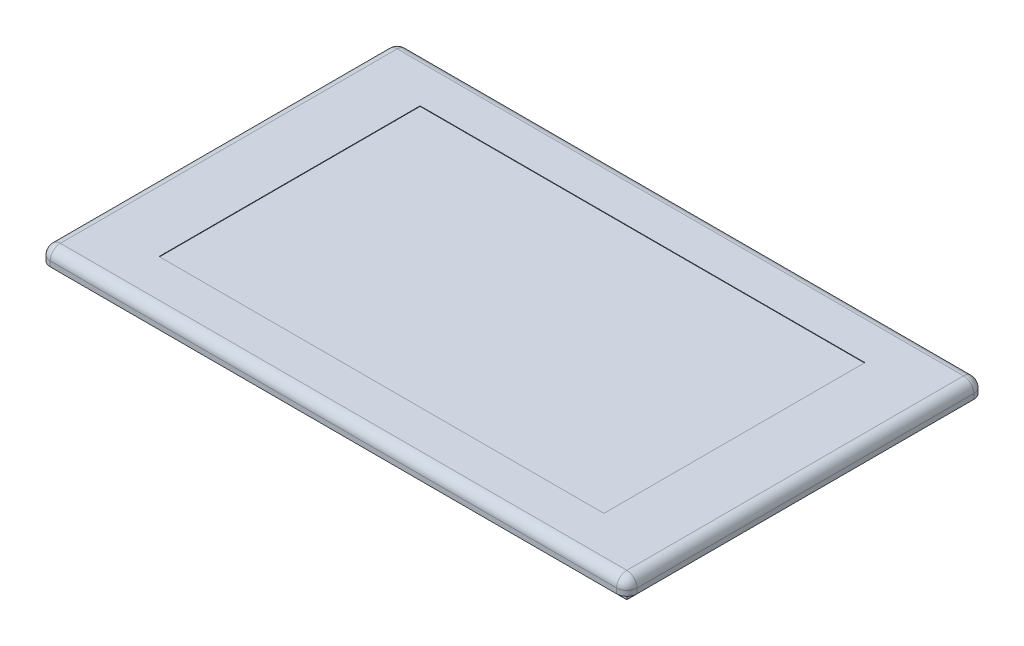
ISO-10303-21;
HEADER;
FILE_DESCRIPTION(('STEP AP214'),'2;1');
FILE_NAME('part.step','',(''),(''),'','','');
FILE_SCHEMA(('AUTOMOTIVE_DESIGN { 1 0 10303 214 1 1 1 1 }'));
ENDSEC;
DATA;
#1=APPLICATION_CONTEXT('core data for automotive mechanical design processes');
#2=APPLICATION_PROTOCOL_DEFINITION('international standard','automotive_design',2000,#1);
#3=PRODUCT_CONTEXT('',#1,'mechanical');
#4=PRODUCT('Part','Part','',(#3));
#5=PRODUCT_RELATED_PRODUCT_CATEGORY('part','',(#4));
#6=PRODUCT_DEFINITION_FORMATION('','',#4);
#7=PRODUCT_DEFINITION_CONTEXT('part definition',#1,'design');
#8=PRODUCT_DEFINITION('design','',#6,#7);
#9=PRODUCT_DEFINITION_SHAPE('','',#8);
#10=(LENGTH_UNIT() NAMED_UNIT(*) SI_UNIT(.MILLI.,.METRE.));
#11=(NAMED_UNIT(*) PLANE_ANGLE_UNIT() SI_UNIT($,.RADIAN.));
#12=(NAMED_UNIT(*) SI_UNIT($,.STERADIAN.) SOLID_ANGLE_UNIT());
#13=UNCERTAINTY_MEASURE_WITH_UNIT(LENGTH_MEASURE(1.E-05),#10,'distance_accuracy_value','');
#14=(GEOMETRIC_REPRESENTATION_CONTEXT(3) GLOBAL_UNCERTAINTY_ASSIGNED_CONTEXT((#13)) GLOBAL_UNIT_ASSIGNED_CONTEXT((#10,
#11,#12)) REPRESENTATION_CONTEXT('',''));
#15=CARTESIAN_POINT('',(0.,0.,0.));
#16=DIRECTION('',(0.,0.,1.));
#17=DIRECTION('',(1.,0.,0.));
#18=AXIS2_PLACEMENT_3D('',#15,#16,#17);
#19=CARTESIAN_POINT('',(0.,0.,0.));
#20=DIRECTION('',(0.,1.,0.));
#21=DIRECTION('',(0.,0.,1.));
#22=AXIS2_PLACEMENT_3D('',#19,#20,#21);
#23=PLANE('',#22);
#24=DIRECTION('',(1.,0.,0.));
#25=VECTOR('',#24,1.);
#26=CARTESIAN_POINT('',(-57.5,0.,35.));
#27=LINE('',#26,#25);
#28=CARTESIAN_POINT('',(-55.5,0.,35.));
#29=VERTEX_POINT('',#28);
#30=CARTESIAN_POINT('',(55.5,0.,35.));
#31=VERTEX_POINT('',#30);
#32=EDGE_CURVE('E257',#29,#31,#27,.T.);
#33=ORIENTED_EDGE('',*,*,#32,.F.);
#34=CARTESIAN_POINT('',(-55.5,0.,33.));
#35=DIRECTION('',(0.,1.,0.));
#36=DIRECTION('',(0.,0.,1.));
#37=AXIS2_PLACEMENT_3D('',#34,#35,#36);
#38=CIRCLE('',#37,2.);
#39=CARTESIAN_POINT('',(-57.5,0.,33.));
#40=VERTEX_POINT('',#39);
#41=EDGE_CURVE('E13',#29,#40,#38,.F.);
#42=ORIENTED_EDGE('',*,*,#41,.T.);
#43=DIRECTION('',(0.,0.,1.));
#44=VECTOR('',#43,1.);
#45=CARTESIAN_POINT('',(-57.5,0.,-35.));
#46=LINE('',#45,#44);
#47=CARTESIAN_POINT('',(-57.5,0.,-33.));
#48=VERTEX_POINT('',#47);
#49=EDGE_CURVE('E254',#48,#40,#46,.T.);
#50=ORIENTED_EDGE('',*,*,#49,.F.);
#51=CARTESIAN_POINT('',(-55.5,0.,-33.));
#52=DIRECTION('',(0.,1.,0.));
#53=DIRECTION('',(0.,0.,1.));
#54=AXIS2_PLACEMENT_3D('',#51,#52,#53);
#55=CIRCLE('',#54,2.);
#56=CARTESIAN_POINT('',(-55.5,0.,-35.));
#57=VERTEX_POINT('',#56);
#58=EDGE_CURVE('E59',#48,#57,#55,.F.);
#59=ORIENTED_EDGE('',*,*,#58,.T.);
#60=DIRECTION('',(-1.,0.,0.));
#61=VECTOR('',#60,1.);
#62=CARTESIAN_POINT('',(-57.5,0.,-35.));
#63=LINE('',#62,#61);
#64=CARTESIAN_POINT('',(55.5,0.,-35.));
#65=VERTEX_POINT('',#64);
#66=EDGE_CURVE('E251',#65,#57,#63,.T.);
#67=ORIENTED_EDGE('',*,*,#66,.F.);
#68=CARTESIAN_POINT('',(55.5,0.,-33.));
#69=DIRECTION('',(0.,1.,0.));
#70=DIRECTION('',(0.,0.,1.));
#71=AXIS2_PLACEMENT_3D('',#68,#69,#70);
#72=CIRCLE('',#71,2.);
#73=CARTESIAN_POINT('',(57.5,0.,-33.));
#74=VERTEX_POINT('',#73);
#75=EDGE_CURVE('E295',#65,#74,#72,.F.);
#76=ORIENTED_EDGE('',*,*,#75,.T.);
#77=DIRECTION('',(0.,0.,-1.));
#78=VECTOR('',#77,1.);
#79=CARTESIAN_POINT('',(57.5,0.,-35.));
#80=LINE('',#79,#78);
#81=CARTESIAN_POINT('',(57.5,0.,33.));
#82=VERTEX_POINT('',#81);
#83=EDGE_CURVE('E249',#82,#74,#80,.T.);
#84=ORIENTED_EDGE('',*,*,#83,.F.);
#85=CARTESIAN_POINT('',(55.5,0.,33.));
#86=DIRECTION('',(0.,1.,0.));
#87=DIRECTION('',(0.,0.,1.));
#88=AXIS2_PLACEMENT_3D('',#85,#86,#87);
#89=CIRCLE('',#88,2.);
#90=EDGE_CURVE('E293',#82,#31,#89,.F.);
#91=ORIENTED_EDGE('',*,*,#90,.T.);
#92=EDGE_LOOP('',(#33,#42,#50,#59,#67,#76,#84,#91));
#93=FACE_BOUND('',#92,.T.);
#94=DIRECTION('',(0.,0.,-1.));
#95=VECTOR('',#94,1.);
#96=CARTESIAN_POINT('',(-54.5,0.,32.));
#97=LINE('',#96,#95);
#98=CARTESIAN_POINT('',(-54.5,0.,32.));
#99=VERTEX_POINT('',#98);
#100=CARTESIAN_POINT('',(-54.5,0.,-32.));
#101=VERTEX_POINT('',#100);
#102=EDGE_CURVE('E227',#99,#101,#97,.T.);
#103=ORIENTED_EDGE('',*,*,#102,.F.);
#104=DIRECTION('',(-1.,0.,0.));
#105=VECTOR('',#104,1.);
#106=CARTESIAN_POINT('',(54.5,0.,32.));
#107=LINE('',#106,#105);
#108=CARTESIAN_POINT('',(54.5,0.,32.));
#109=VERTEX_POINT('',#108);
#110=EDGE_CURVE('E220',#109,#99,#107,.T.);
#111=ORIENTED_EDGE('',*,*,#110,.F.);
#112=DIRECTION('',(0.,0.,1.));
#113=VECTOR('',#112,1.);
#114=CARTESIAN_POINT('',(54.5,0.,32.));
#115=LINE('',#114,#113);
#116=CARTESIAN_POINT('',(54.5,0.,-32.));
#117=VERTEX_POINT('',#116);
#118=EDGE_CURVE('E233',#117,#109,#115,.T.);
#119=ORIENTED_EDGE('',*,*,#118,.F.);
#120=DIRECTION('',(1.,0.,0.));
#121=VECTOR('',#120,1.);
#122=CARTESIAN_POINT('',(54.5,0.,-32.));
#123=LINE('',#122,#121);
#124=EDGE_CURVE('E230',#101,#117,#123,.T.);
#125=ORIENTED_EDGE('',*,*,#124,.F.);
#126=EDGE_LOOP('',(#103,#111,#119,#125));
#127=FACE_BOUND('',#126,.T.);
#128=ADVANCED_FACE('F50',(#93,#127),#23,.F.);
#129=CARTESIAN_POINT('',(57.5,3.,-35.));
#130=DIRECTION('',(-1.,0.,0.));
#131=DIRECTION('',(0.,0.,1.));
#132=AXIS2_PLACEMENT_3D('',#129,#130,#131);
#133=PLANE('',#132);
#134=ORIENTED_EDGE('',*,*,#83,.T.);
#135=DIRECTION('',(0.,-1.,0.));
#136=VECTOR('',#135,1.);
#137=CARTESIAN_POINT('',(57.5,3.,-33.));
#138=LINE('',#137,#136);
#139=CARTESIAN_POINT('',(57.5,1.,-33.));
#140=VERTEX_POINT('',#139);
#141=EDGE_CURVE('E75',#74,#140,#138,.F.);
#142=ORIENTED_EDGE('',*,*,#141,.T.);
#143=DIRECTION('',(0.,0.,-1.));
#144=VECTOR('',#143,1.);
#145=CARTESIAN_POINT('',(57.5,1.,35.));
#146=LINE('',#145,#144);
#147=CARTESIAN_POINT('',(57.5,1.,33.));
#148=VERTEX_POINT('',#147);
#149=EDGE_CURVE('E290',#140,#148,#146,.F.);
#150=ORIENTED_EDGE('',*,*,#149,.T.);
#151=DIRECTION('',(0.,-1.,0.));
#152=VECTOR('',#151,1.);
#153=CARTESIAN_POINT('',(57.5,3.,33.));
#154=LINE('',#153,#152);
#155=EDGE_CURVE('E288',#148,#82,#154,.T.);
#156=ORIENTED_EDGE('',*,*,#155,.T.);
#157=EDGE_LOOP('',(#134,#142,#150,#156));
#158=FACE_BOUND('',#157,.T.);
#159=ADVANCED_FACE('F364',(#158),#133,.F.);
#160=CARTESIAN_POINT('',(-57.5,3.,-35.));
#161=DIRECTION('',(0.,0.,1.));
#162=DIRECTION('',(1.,0.,0.));
#163=AXIS2_PLACEMENT_3D('',#160,#161,#162);
#164=PLANE('',#163);
#165=ORIENTED_EDGE('',*,*,#66,.T.);
#166=DIRECTION('',(0.,-1.,0.));
#167=VECTOR('',#166,1.);
#168=CARTESIAN_POINT('',(-55.5,3.,-35.));
#169=LINE('',#168,#167);
#170=CARTESIAN_POINT('',(-55.5,1.,-35.));
#171=VERTEX_POINT('',#170);
#172=EDGE_CURVE('E286',#57,#171,#169,.F.);
#173=ORIENTED_EDGE('',*,*,#172,.T.);
#174=DIRECTION('',(-1.,0.,0.));
#175=VECTOR('',#174,1.);
#176=CARTESIAN_POINT('',(57.5,1.,-35.));
#177=LINE('',#176,#175);
#178=CARTESIAN_POINT('',(55.5,1.,-35.));
#179=VERTEX_POINT('',#178);
#180=EDGE_CURVE('E284',#171,#179,#177,.F.);
#181=ORIENTED_EDGE('',*,*,#180,.T.);
#182=DIRECTION('',(0.,-1.,0.));
#183=VECTOR('',#182,1.);
#184=CARTESIAN_POINT('',(55.5,3.,-35.));
#185=LINE('',#184,#183);
#186=EDGE_CURVE('E282',#179,#65,#185,.T.);
#187=ORIENTED_EDGE('',*,*,#186,.T.);
#188=EDGE_LOOP('',(#165,#173,#181,#187));
#189=FACE_BOUND('',#188,.T.);
#190=ADVANCED_FACE('F353',(#189),#164,.F.);
#191=CARTESIAN_POINT('',(-57.5,3.,-35.));
#192=DIRECTION('',(1.,0.,0.));
#193=DIRECTION('',(0.,0.,-1.));
#194=AXIS2_PLACEMENT_3D('',#191,#192,#193);
#195=PLANE('',#194);
#196=ORIENTED_EDGE('',*,*,#49,.T.);
#197=DIRECTION('',(0.,-1.,0.));
#198=VECTOR('',#197,1.);
#199=CARTESIAN_POINT('',(-57.5,3.,33.));
#200=LINE('',#199,#198);
#201=CARTESIAN_POINT('',(-57.5,1.,33.));
#202=VERTEX_POINT('',#201);
#203=EDGE_CURVE('E280',#40,#202,#200,.F.);
#204=ORIENTED_EDGE('',*,*,#203,.T.);
#205=DIRECTION('',(0.,0.,1.));
#206=VECTOR('',#205,1.);
#207=CARTESIAN_POINT('',(-57.5,1.,-35.));
#208=LINE('',#207,#206);
#209=CARTESIAN_POINT('',(-57.5,1.,-33.));
#210=VERTEX_POINT('',#209);
#211=EDGE_CURVE('E278',#202,#210,#208,.F.);
#212=ORIENTED_EDGE('',*,*,#211,.T.);
#213=DIRECTION('',(0.,-1.,0.));
#214=VECTOR('',#213,1.);
#215=CARTESIAN_POINT('',(-57.5,3.,-33.));
#216=LINE('',#215,#214);
#217=EDGE_CURVE('E276',#210,#48,#216,.T.);
#218=ORIENTED_EDGE('',*,*,#217,.T.);
#219=EDGE_LOOP('',(#196,#204,#212,#218));
#220=FACE_BOUND('',#219,.T.);
#221=ADVANCED_FACE('F389',(#220),#195,.F.);
#222=CARTESIAN_POINT('',(-57.5,3.,35.));
#223=DIRECTION('',(0.,0.,-1.));
#224=DIRECTION('',(-1.,0.,0.));
#225=AXIS2_PLACEMENT_3D('',#222,#223,#224);
#226=PLANE('',#225);
#227=DIRECTION('',(1.,0.,0.));
#228=VECTOR('',#227,1.);
#229=CARTESIAN_POINT('',(-57.5,1.,35.));
#230=LINE('',#229,#228);
#231=CARTESIAN_POINT('',(55.5,1.,35.));
#232=VERTEX_POINT('',#231);
#233=CARTESIAN_POINT('',(-55.5,1.,35.));
#234=VERTEX_POINT('',#233);
#235=EDGE_CURVE('E271',#232,#234,#230,.F.);
#236=ORIENTED_EDGE('',*,*,#235,.T.);
#237=DIRECTION('',(0.,-1.,0.));
#238=VECTOR('',#237,1.);
#239=CARTESIAN_POINT('',(-55.5,3.,35.));
#240=LINE('',#239,#238);
#241=EDGE_CURVE('E274',#234,#29,#240,.T.);
#242=ORIENTED_EDGE('',*,*,#241,.T.);
#243=ORIENTED_EDGE('',*,*,#32,.T.);
#244=DIRECTION('',(0.,-1.,0.));
#245=VECTOR('',#244,1.);
#246=CARTESIAN_POINT('',(55.5,3.,35.));
#247=LINE('',#246,#245);
#248=EDGE_CURVE('E269',#31,#232,#247,.F.);
#249=ORIENTED_EDGE('',*,*,#248,.T.);
#250=EDGE_LOOP('',(#236,#242,#243,#249));
#251=FACE_BOUND('',#250,.T.);
#252=ADVANCED_FACE('F381',(#251),#226,.F.);
#253=CARTESIAN_POINT('',(0.,3.,0.));
#254=DIRECTION('',(0.,1.,0.));
#255=DIRECTION('',(0.,0.,1.));
#256=AXIS2_PLACEMENT_3D('',#253,#254,#255);
#257=PLANE('',#256);
#258=DIRECTION('',(0.,0.,-1.));
#259=VECTOR('',#258,1.);
#260=CARTESIAN_POINT('',(43.5862200516437,3.,25.5777872693918));
#261=LINE('',#260,#259);
#262=CARTESIAN_POINT('',(43.5862200516437,3.,25.5777872693918));
#263=VERTEX_POINT('',#262);
#264=CARTESIAN_POINT('',(43.5862200516437,3.,-25.5777872693918));
#265=VERTEX_POINT('',#264);
#266=EDGE_CURVE('E67',#263,#265,#261,.T.);
#267=ORIENTED_EDGE('',*,*,#266,.F.);
#268=DIRECTION('',(1.,0.,0.));
#269=VECTOR('',#268,1.);
#270=CARTESIAN_POINT('',(-43.5862200516437,3.,25.5777872693918));
#271=LINE('',#270,#269);
#272=CARTESIAN_POINT('',(-43.5862200516437,3.,25.5777872693918));
#273=VERTEX_POINT('',#272);
#274=EDGE_CURVE('E197',#273,#263,#271,.T.);
#275=ORIENTED_EDGE('',*,*,#274,.F.);
#276=DIRECTION('',(0.,0.,1.));
#277=VECTOR('',#276,1.);
#278=CARTESIAN_POINT('',(-43.5862200516437,3.,25.5777872693918));
#279=LINE('',#278,#277);
#280=CARTESIAN_POINT('',(-43.5862200516437,3.,-25.5777872693918));
#281=VERTEX_POINT('',#280);
#282=EDGE_CURVE('E200',#281,#273,#279,.T.);
#283=ORIENTED_EDGE('',*,*,#282,.F.);
#284=DIRECTION('',(-1.,0.,0.));
#285=VECTOR('',#284,1.);
#286=CARTESIAN_POINT('',(-43.5862200516437,3.,-25.5777872693918));
#287=LINE('',#286,#285);
#288=EDGE_CURVE('E206',#265,#281,#287,.T.);
#289=ORIENTED_EDGE('',*,*,#288,.F.);
#290=EDGE_LOOP('',(#267,#275,#283,#289));
#291=FACE_BOUND('',#290,.T.);
#292=DIRECTION('',(0.,0.,1.));
#293=VECTOR('',#292,1.);
#294=CARTESIAN_POINT('',(-55.5,3.,35.));
#295=LINE('',#294,#293);
#296=CARTESIAN_POINT('',(-55.5,3.,-33.));
#297=VERTEX_POINT('',#296);
#298=CARTESIAN_POINT('',(-55.5,3.,33.));
#299=VERTEX_POINT('',#298);
#300=EDGE_CURVE('E264',#297,#299,#295,.T.);
#301=ORIENTED_EDGE('',*,*,#300,.T.);
#302=DIRECTION('',(1.,0.,0.));
#303=VECTOR('',#302,1.);
#304=CARTESIAN_POINT('',(57.5,3.,33.));
#305=LINE('',#304,#303);
#306=CARTESIAN_POINT('',(55.5,3.,33.));
#307=VERTEX_POINT('',#306);
#308=EDGE_CURVE('E266',#299,#307,#305,.T.);
#309=ORIENTED_EDGE('',*,*,#308,.T.);
#310=DIRECTION('',(0.,0.,-1.));
#311=VECTOR('',#310,1.);
#312=CARTESIAN_POINT('',(55.5,3.,-35.));
#313=LINE('',#312,#311);
#314=CARTESIAN_POINT('',(55.5,3.,-33.));
#315=VERTEX_POINT('',#314);
#316=EDGE_CURVE('E260',#307,#315,#313,.T.);
#317=ORIENTED_EDGE('',*,*,#316,.T.);
#318=DIRECTION('',(-1.,0.,0.));
#319=VECTOR('',#318,1.);
#320=CARTESIAN_POINT('',(-57.5,3.,-33.));
#321=LINE('',#320,#319);
#322=EDGE_CURVE('E262',#315,#297,#321,.T.);
#323=ORIENTED_EDGE('',*,*,#322,.T.);
#324=EDGE_LOOP('',(#301,#309,#317,#323));
#325=FACE_BOUND('',#324,.T.);
#326=ADVANCED_FACE('F343',(#291,#325),#257,.T.);
#327=CARTESIAN_POINT('',(-54.5,-3.,32.));
#328=DIRECTION('',(1.,0.,0.));
#329=DIRECTION('',(0.,0.,-1.));
#330=AXIS2_PLACEMENT_3D('',#327,#328,#329);
#331=PLANE('',#330);
#332=ORIENTED_EDGE('',*,*,#102,.T.);
#333=DIRECTION('',(0.,1.,0.));
#334=VECTOR('',#333,1.);
#335=CARTESIAN_POINT('',(-54.5,-3.,-32.));
#336=LINE('',#335,#334);
#337=CARTESIAN_POINT('',(-54.5,-3.,-32.));
#338=VERTEX_POINT('',#337);
#339=EDGE_CURVE('E246',#338,#101,#336,.T.);
#340=ORIENTED_EDGE('',*,*,#339,.F.);
#341=DIRECTION('',(0.,0.,-1.));
#342=VECTOR('',#341,1.);
#343=CARTESIAN_POINT('',(-54.5,-3.,32.));
#344=LINE('',#343,#342);
#345=CARTESIAN_POINT('',(-54.5,-3.,32.));
#346=VERTEX_POINT('',#345);
#347=EDGE_CURVE('E216',#346,#338,#344,.T.);
#348=ORIENTED_EDGE('',*,*,#347,.F.);
#349=DIRECTION('',(0.,1.,0.));
#350=VECTOR('',#349,1.);
#351=CARTESIAN_POINT('',(-54.5,-3.,32.));
#352=LINE('',#351,#350);
#353=EDGE_CURVE('E226',#346,#99,#352,.T.);
#354=ORIENTED_EDGE('',*,*,#353,.T.);
#355=EDGE_LOOP('',(#332,#340,#348,#354));
#356=FACE_BOUND('',#355,.T.);
#357=ADVANCED_FACE('F521',(#356),#331,.F.);
#358=CARTESIAN_POINT('',(54.5,-3.,-32.));
#359=DIRECTION('',(0.,0.,1.));
#360=DIRECTION('',(1.,0.,0.));
#361=AXIS2_PLACEMENT_3D('',#358,#359,#360);
#362=PLANE('',#361);
#363=ORIENTED_EDGE('',*,*,#124,.T.);
#364=DIRECTION('',(0.,1.,0.));
#365=VECTOR('',#364,1.);
#366=CARTESIAN_POINT('',(54.5,-3.,-32.));
#367=LINE('',#366,#365);
#368=CARTESIAN_POINT('',(54.5,-3.,-32.));
#369=VERTEX_POINT('',#368);
#370=EDGE_CURVE('E243',#369,#117,#367,.T.);
#371=ORIENTED_EDGE('',*,*,#370,.F.);
#372=DIRECTION('',(1.,0.,0.));
#373=VECTOR('',#372,1.);
#374=CARTESIAN_POINT('',(54.5,-3.,-32.));
#375=LINE('',#374,#373);
#376=EDGE_CURVE('E219',#338,#369,#375,.T.);
#377=ORIENTED_EDGE('',*,*,#376,.F.);
#378=ORIENTED_EDGE('',*,*,#339,.T.);
#379=EDGE_LOOP('',(#363,#371,#377,#378));
#380=FACE_BOUND('',#379,.T.);
#381=ADVANCED_FACE('F549',(#380),#362,.F.);
#382=CARTESIAN_POINT('',(54.5,-3.,32.));
#383=DIRECTION('',(-1.,0.,0.));
#384=DIRECTION('',(0.,0.,1.));
#385=AXIS2_PLACEMENT_3D('',#382,#383,#384);
#386=PLANE('',#385);
#387=ORIENTED_EDGE('',*,*,#118,.T.);
#388=DIRECTION('',(0.,1.,0.));
#389=VECTOR('',#388,1.);
#390=CARTESIAN_POINT('',(54.5,-3.,32.));
#391=LINE('',#390,#389);
#392=CARTESIAN_POINT('',(54.5,-3.,32.));
#393=VERTEX_POINT('',#392);
#394=EDGE_CURVE('E240',#393,#109,#391,.T.);
#395=ORIENTED_EDGE('',*,*,#394,.F.);
#396=DIRECTION('',(0.,0.,1.));
#397=VECTOR('',#396,1.);
#398=CARTESIAN_POINT('',(54.5,-3.,32.));
#399=LINE('',#398,#397);
#400=EDGE_CURVE('E222',#369,#393,#399,.T.);
#401=ORIENTED_EDGE('',*,*,#400,.F.);
#402=ORIENTED_EDGE('',*,*,#370,.T.);
#403=EDGE_LOOP('',(#387,#395,#401,#402));
#404=FACE_BOUND('',#403,.T.);
#405=ADVANCED_FACE('F556',(#404),#386,.F.);
#406=CARTESIAN_POINT('',(54.5,-3.,32.));
#407=DIRECTION('',(0.,0.,-1.));
#408=DIRECTION('',(-1.,0.,0.));
#409=AXIS2_PLACEMENT_3D('',#406,#407,#408);
#410=PLANE('',#409);
#411=ORIENTED_EDGE('',*,*,#110,.T.);
#412=ORIENTED_EDGE('',*,*,#353,.F.);
#413=DIRECTION('',(-1.,0.,0.));
#414=VECTOR('',#413,1.);
#415=CARTESIAN_POINT('',(54.5,-3.,32.));
#416=LINE('',#415,#414);
#417=EDGE_CURVE('E224',#393,#346,#416,.T.);
#418=ORIENTED_EDGE('',*,*,#417,.F.);
#419=ORIENTED_EDGE('',*,*,#394,.T.);
#420=EDGE_LOOP('',(#411,#412,#418,#419));
#421=FACE_BOUND('',#420,.T.);
#422=ADVANCED_FACE('F397',(#421),#410,.F.);
#423=CARTESIAN_POINT('',(0.,-3.,0.));
#424=DIRECTION('',(0.,1.,0.));
#425=DIRECTION('',(0.,0.,1.));
#426=AXIS2_PLACEMENT_3D('',#423,#424,#425);
#427=PLANE('',#426);
#428=ORIENTED_EDGE('',*,*,#347,.T.);
#429=ORIENTED_EDGE('',*,*,#376,.T.);
#430=ORIENTED_EDGE('',*,*,#400,.T.);
#431=ORIENTED_EDGE('',*,*,#417,.T.);
#432=EDGE_LOOP('',(#428,#429,#430,#431));
#433=FACE_BOUND('',#432,.T.);
#434=ADVANCED_FACE('F392',(#433),#427,.F.);
#435=CARTESIAN_POINT('',(-55.5,3.,-33.));
#436=DIRECTION('',(0.,-1.,0.));
#437=DIRECTION('',(0.,0.,-1.));
#438=AXIS2_PLACEMENT_3D('',#435,#436,#437);
#439=CYLINDRICAL_SURFACE('',#438,2.);
#440=ORIENTED_EDGE('',*,*,#58,.F.);
#441=ORIENTED_EDGE('',*,*,#217,.F.);
#442=CARTESIAN_POINT('',(-55.5,1.,-33.));
#443=DIRECTION('',(0.,1.,0.));
#444=DIRECTION('',(0.,0.,1.));
#445=AXIS2_PLACEMENT_3D('',#442,#443,#444);
#446=CIRCLE('',#445,2.);
#447=EDGE_CURVE('E54',#171,#210,#446,.T.);
#448=ORIENTED_EDGE('',*,*,#447,.F.);
#449=ORIENTED_EDGE('',*,*,#172,.F.);
#450=EDGE_LOOP('',(#440,#441,#448,#449));
#451=FACE_BOUND('',#450,.T.);
#452=ADVANCED_FACE('F52',(#451),#439,.T.);
#453=CARTESIAN_POINT('',(0.,1.,-33.));
#454=DIRECTION('',(1.,0.,0.));
#455=DIRECTION('',(0.,0.,-1.));
#456=AXIS2_PLACEMENT_3D('',#453,#454,#455);
#457=CYLINDRICAL_SURFACE('',#456,2.);
#458=CARTESIAN_POINT('',(55.5,1.,-33.));
#459=DIRECTION('',(1.,0.,0.));
#460=DIRECTION('',(0.,1.,0.));
#461=AXIS2_PLACEMENT_3D('',#458,#459,#460);
#462=CIRCLE('',#461,2.);
#463=EDGE_CURVE('E322',#179,#315,#462,.T.);
#464=ORIENTED_EDGE('',*,*,#463,.F.);
#465=ORIENTED_EDGE('',*,*,#180,.F.);
#466=CARTESIAN_POINT('',(-55.5,1.,-33.));
#467=DIRECTION('',(-1.,0.,0.));
#468=DIRECTION('',(0.,0.,1.));
#469=AXIS2_PLACEMENT_3D('',#466,#467,#468);
#470=CIRCLE('',#469,2.);
#471=EDGE_CURVE('E324',#297,#171,#470,.T.);
#472=ORIENTED_EDGE('',*,*,#471,.F.);
#473=ORIENTED_EDGE('',*,*,#322,.F.);
#474=EDGE_LOOP('',(#464,#465,#472,#473));
#475=FACE_BOUND('',#474,.T.);
#476=ADVANCED_FACE('F350',(#475),#457,.T.);
#477=CARTESIAN_POINT('',(55.5,3.,-33.));
#478=DIRECTION('',(0.,-1.,0.));
#479=DIRECTION('',(0.,0.,-1.));
#480=AXIS2_PLACEMENT_3D('',#477,#478,#479);
#481=CYLINDRICAL_SURFACE('',#480,2.);
#482=ORIENTED_EDGE('',*,*,#75,.F.);
#483=ORIENTED_EDGE('',*,*,#186,.F.);
#484=CARTESIAN_POINT('',(55.5,1.,-33.));
#485=DIRECTION('',(0.,1.,0.));
#486=DIRECTION('',(0.,0.,1.));
#487=AXIS2_PLACEMENT_3D('',#484,#485,#486);
#488=CIRCLE('',#487,2.);
#489=EDGE_CURVE('E319',#140,#179,#488,.T.);
#490=ORIENTED_EDGE('',*,*,#489,.F.);
#491=ORIENTED_EDGE('',*,*,#141,.F.);
#492=EDGE_LOOP('',(#482,#483,#490,#491));
#493=FACE_BOUND('',#492,.T.);
#494=ADVANCED_FACE('F357',(#493),#481,.T.);
#495=CARTESIAN_POINT('',(-55.5,1.,-33.));
#496=DIRECTION('',(0.,0.,1.));
#497=DIRECTION('',(1.,0.,0.));
#498=AXIS2_PLACEMENT_3D('',#495,#496,#497);
#499=SPHERICAL_SURFACE('',#498,2.);
#500=ORIENTED_EDGE('',*,*,#471,.T.);
#501=ORIENTED_EDGE('',*,*,#447,.T.);
#502=CARTESIAN_POINT('',(-55.5,1.,-33.));
#503=DIRECTION('',(0.,0.,-1.));
#504=DIRECTION('',(-1.,0.,0.));
#505=AXIS2_PLACEMENT_3D('',#502,#503,#504);
#506=CIRCLE('',#505,2.);
#507=EDGE_CURVE('E316',#297,#210,#506,.F.);
#508=ORIENTED_EDGE('',*,*,#507,.F.);
#509=EDGE_LOOP('',(#500,#501,#508));
#510=FACE_BOUND('',#509,.T.);
#511=ADVANCED_FACE('F331',(#510),#499,.T.);
#512=CARTESIAN_POINT('',(55.5,1.,-33.));
#513=DIRECTION('',(0.,0.,1.));
#514=DIRECTION('',(1.,0.,0.));
#515=AXIS2_PLACEMENT_3D('',#512,#513,#514);
#516=SPHERICAL_SURFACE('',#515,2.);
#517=ORIENTED_EDGE('',*,*,#489,.T.);
#518=ORIENTED_EDGE('',*,*,#463,.T.);
#519=CARTESIAN_POINT('',(55.5,1.,-33.));
#520=DIRECTION('',(0.,0.,-1.));
#521=DIRECTION('',(-1.,0.,0.));
#522=AXIS2_PLACEMENT_3D('',#519,#520,#521);
#523=CIRCLE('',#522,2.);
#524=EDGE_CURVE('E313',#140,#315,#523,.F.);
#525=ORIENTED_EDGE('',*,*,#524,.F.);
#526=EDGE_LOOP('',(#517,#518,#525));
#527=FACE_BOUND('',#526,.T.);
#528=ADVANCED_FACE('F431',(#527),#516,.T.);
#529=CARTESIAN_POINT('',(-55.5,3.,33.));
#530=DIRECTION('',(0.,-1.,0.));
#531=DIRECTION('',(0.,0.,-1.));
#532=AXIS2_PLACEMENT_3D('',#529,#530,#531);
#533=CYLINDRICAL_SURFACE('',#532,2.);
#534=ORIENTED_EDGE('',*,*,#41,.F.);
#535=ORIENTED_EDGE('',*,*,#241,.F.);
#536=CARTESIAN_POINT('',(-55.5,1.,33.));
#537=DIRECTION('',(0.,1.,0.));
#538=DIRECTION('',(0.,0.,1.));
#539=AXIS2_PLACEMENT_3D('',#536,#537,#538);
#540=CIRCLE('',#539,2.);
#541=EDGE_CURVE('E310',#202,#234,#540,.T.);
#542=ORIENTED_EDGE('',*,*,#541,.F.);
#543=ORIENTED_EDGE('',*,*,#203,.F.);
#544=EDGE_LOOP('',(#534,#535,#542,#543));
#545=FACE_BOUND('',#544,.T.);
#546=ADVANCED_FACE('F387',(#545),#533,.T.);
#547=CARTESIAN_POINT('',(-55.5,1.,0.));
#548=DIRECTION('',(0.,0.,-1.));
#549=DIRECTION('',(-1.,0.,0.));
#550=AXIS2_PLACEMENT_3D('',#547,#548,#549);
#551=CYLINDRICAL_SURFACE('',#550,2.);
#552=ORIENTED_EDGE('',*,*,#507,.T.);
#553=ORIENTED_EDGE('',*,*,#211,.F.);
#554=CARTESIAN_POINT('',(-55.5,1.,33.));
#555=DIRECTION('',(0.,0.,1.));
#556=DIRECTION('',(1.,0.,0.));
#557=AXIS2_PLACEMENT_3D('',#554,#555,#556);
#558=CIRCLE('',#557,2.);
#559=EDGE_CURVE('E307',#299,#202,#558,.T.);
#560=ORIENTED_EDGE('',*,*,#559,.F.);
#561=ORIENTED_EDGE('',*,*,#300,.F.);
#562=EDGE_LOOP('',(#552,#553,#560,#561));
#563=FACE_BOUND('',#562,.T.);
#564=ADVANCED_FACE('F338',(#563),#551,.T.);
#565=CARTESIAN_POINT('',(55.5,1.,0.));
#566=DIRECTION('',(0.,0.,1.));
#567=DIRECTION('',(1.,0.,0.));
#568=AXIS2_PLACEMENT_3D('',#565,#566,#567);
#569=CYLINDRICAL_SURFACE('',#568,2.);
#570=ORIENTED_EDGE('',*,*,#524,.T.);
#571=ORIENTED_EDGE('',*,*,#316,.F.);
#572=CARTESIAN_POINT('',(55.5,1.,33.));
#573=DIRECTION('',(0.,0.,1.));
#574=DIRECTION('',(1.,0.,0.));
#575=AXIS2_PLACEMENT_3D('',#572,#573,#574);
#576=CIRCLE('',#575,2.);
#577=EDGE_CURVE('E304',#148,#307,#576,.T.);
#578=ORIENTED_EDGE('',*,*,#577,.F.);
#579=ORIENTED_EDGE('',*,*,#149,.F.);
#580=EDGE_LOOP('',(#570,#571,#578,#579));
#581=FACE_BOUND('',#580,.T.);
#582=ADVANCED_FACE('F374',(#581),#569,.T.);
#583=CARTESIAN_POINT('',(55.5,3.,33.));
#584=DIRECTION('',(0.,-1.,0.));
#585=DIRECTION('',(0.,0.,-1.));
#586=AXIS2_PLACEMENT_3D('',#583,#584,#585);
#587=CYLINDRICAL_SURFACE('',#586,2.);
#588=ORIENTED_EDGE('',*,*,#90,.F.);
#589=ORIENTED_EDGE('',*,*,#155,.F.);
#590=CARTESIAN_POINT('',(55.5,1.,33.));
#591=DIRECTION('',(0.,1.,0.));
#592=DIRECTION('',(0.,0.,1.));
#593=AXIS2_PLACEMENT_3D('',#590,#591,#592);
#594=CIRCLE('',#593,2.);
#595=EDGE_CURVE('E301',#232,#148,#594,.T.);
#596=ORIENTED_EDGE('',*,*,#595,.F.);
#597=ORIENTED_EDGE('',*,*,#248,.F.);
#598=EDGE_LOOP('',(#588,#589,#596,#597));
#599=FACE_BOUND('',#598,.T.);
#600=ADVANCED_FACE('F370',(#599),#587,.T.);
#601=CARTESIAN_POINT('',(-55.5,1.,33.));
#602=DIRECTION('',(0.,0.,1.));
#603=DIRECTION('',(1.,0.,0.));
#604=AXIS2_PLACEMENT_3D('',#601,#602,#603);
#605=SPHERICAL_SURFACE('',#604,2.);
#606=ORIENTED_EDGE('',*,*,#559,.T.);
#607=ORIENTED_EDGE('',*,*,#541,.T.);
#608=CARTESIAN_POINT('',(-55.5,1.,33.));
#609=DIRECTION('',(-1.,0.,0.));
#610=DIRECTION('',(0.,0.,1.));
#611=AXIS2_PLACEMENT_3D('',#608,#609,#610);
#612=CIRCLE('',#611,2.);
#613=EDGE_CURVE('E299',#299,#234,#612,.F.);
#614=ORIENTED_EDGE('',*,*,#613,.F.);
#615=EDGE_LOOP('',(#606,#607,#614));
#616=FACE_BOUND('',#615,.T.);
#617=ADVANCED_FACE('F419',(#616),#605,.T.);
#618=CARTESIAN_POINT('',(55.5,1.,33.));
#619=DIRECTION('',(0.,0.,1.));
#620=DIRECTION('',(1.,0.,0.));
#621=AXIS2_PLACEMENT_3D('',#618,#619,#620);
#622=SPHERICAL_SURFACE('',#621,2.);
#623=ORIENTED_EDGE('',*,*,#595,.T.);
#624=ORIENTED_EDGE('',*,*,#577,.T.);
#625=CARTESIAN_POINT('',(55.5,1.,33.));
#626=DIRECTION('',(1.,0.,0.));
#627=DIRECTION('',(0.,0.,-1.));
#628=AXIS2_PLACEMENT_3D('',#625,#626,#627);
#629=CIRCLE('',#628,2.);
#630=EDGE_CURVE('E212',#232,#307,#629,.F.);
#631=ORIENTED_EDGE('',*,*,#630,.F.);
#632=EDGE_LOOP('',(#623,#624,#631));
#633=FACE_BOUND('',#632,.T.);
#634=ADVANCED_FACE('F377',(#633),#622,.T.);
#635=CARTESIAN_POINT('',(0.,1.,33.));
#636=DIRECTION('',(-1.,0.,0.));
#637=DIRECTION('',(0.,0.,1.));
#638=AXIS2_PLACEMENT_3D('',#635,#636,#637);
#639=CYLINDRICAL_SURFACE('',#638,2.);
#640=ORIENTED_EDGE('',*,*,#613,.T.);
#641=ORIENTED_EDGE('',*,*,#235,.F.);
#642=ORIENTED_EDGE('',*,*,#630,.T.);
#643=ORIENTED_EDGE('',*,*,#308,.F.);
#644=EDGE_LOOP('',(#640,#641,#642,#643));
#645=FACE_BOUND('',#644,.T.);
#646=ADVANCED_FACE('F379',(#645),#639,.T.);
#647=CARTESIAN_POINT('',(43.5862200516437,2.9,25.5777872693918));
#648=DIRECTION('',(1.,0.,0.));
#649=DIRECTION('',(0.,0.,-1.));
#650=AXIS2_PLACEMENT_3D('',#647,#648,#649);
#651=PLANE('',#650);
#652=ORIENTED_EDGE('',*,*,#266,.T.);
#653=DIRECTION('',(0.,1.,0.));
#654=VECTOR('',#653,1.);
#655=CARTESIAN_POINT('',(43.5862200516437,2.9,-25.5777872693918));
#656=LINE('',#655,#654);
#657=CARTESIAN_POINT('',(43.5862200516437,2.9,-25.5777872693918));
#658=VERTEX_POINT('',#657);
#659=EDGE_CURVE('E175',#658,#265,#656,.T.);
#660=ORIENTED_EDGE('',*,*,#659,.F.);
#661=DIRECTION('',(0.,0.,-1.));
#662=VECTOR('',#661,1.);
#663=CARTESIAN_POINT('',(43.5862200516437,2.9,25.5777872693918));
#664=LINE('',#663,#662);
#665=CARTESIAN_POINT('',(43.5862200516437,2.9,25.5777872693918));
#666=VERTEX_POINT('',#665);
#667=EDGE_CURVE('E179',#666,#658,#664,.T.);
#668=ORIENTED_EDGE('',*,*,#667,.F.);
#669=DIRECTION('',(0.,1.,0.));
#670=VECTOR('',#669,1.);
#671=CARTESIAN_POINT('',(43.5862200516437,2.9,25.5777872693918));
#672=LINE('',#671,#670);
#673=EDGE_CURVE('E210',#666,#263,#672,.T.);
#674=ORIENTED_EDGE('',*,*,#673,.T.);
#675=EDGE_LOOP('',(#652,#660,#668,#674));
#676=FACE_BOUND('',#675,.T.);
#677=ADVANCED_FACE('F177',(#676),#651,.F.);
#678=CARTESIAN_POINT('',(-43.5862200516437,2.9,25.5777872693918));
#679=DIRECTION('',(0.,0.,1.));
#680=DIRECTION('',(1.,0.,0.));
#681=AXIS2_PLACEMENT_3D('',#678,#679,#680);
#682=PLANE('',#681);
#683=ORIENTED_EDGE('',*,*,#274,.T.);
#684=ORIENTED_EDGE('',*,*,#673,.F.);
#685=DIRECTION('',(1.,0.,0.));
#686=VECTOR('',#685,1.);
#687=CARTESIAN_POINT('',(-43.5862200516437,2.9,25.5777872693918));
#688=LINE('',#687,#686);
#689=CARTESIAN_POINT('',(-43.5862200516437,2.9,25.5777872693918));
#690=VERTEX_POINT('',#689);
#691=EDGE_CURVE('E185',#690,#666,#688,.T.);
#692=ORIENTED_EDGE('',*,*,#691,.F.);
#693=DIRECTION('',(0.,1.,0.));
#694=VECTOR('',#693,1.);
#695=CARTESIAN_POINT('',(-43.5862200516437,2.9,25.5777872693918));
#696=LINE('',#695,#694);
#697=EDGE_CURVE('E213',#690,#273,#696,.T.);
#698=ORIENTED_EDGE('',*,*,#697,.T.);
#699=EDGE_LOOP('',(#683,#684,#692,#698));
#700=FACE_BOUND('',#699,.T.);
#701=ADVANCED_FACE('F484',(#700),#682,.F.);
#702=CARTESIAN_POINT('',(-43.5862200516437,2.9,25.5777872693918));
#703=DIRECTION('',(-1.,0.,0.));
#704=DIRECTION('',(0.,0.,1.));
#705=AXIS2_PLACEMENT_3D('',#702,#703,#704);
#706=PLANE('',#705);
#707=ORIENTED_EDGE('',*,*,#282,.T.);
#708=ORIENTED_EDGE('',*,*,#697,.F.);
#709=DIRECTION('',(0.,0.,1.));
#710=VECTOR('',#709,1.);
#711=CARTESIAN_POINT('',(-43.5862200516437,2.9,25.5777872693918));
#712=LINE('',#711,#710);
#713=CARTESIAN_POINT('',(-43.5862200516437,2.9,-25.5777872693918));
#714=VERTEX_POINT('',#713);
#715=EDGE_CURVE('E193',#714,#690,#712,.T.);
#716=ORIENTED_EDGE('',*,*,#715,.F.);
#717=DIRECTION('',(0.,1.,0.));
#718=VECTOR('',#717,1.);
#719=CARTESIAN_POINT('',(-43.5862200516437,2.9,-25.5777872693918));
#720=LINE('',#719,#718);
#721=EDGE_CURVE('E184',#714,#281,#720,.T.);
#722=ORIENTED_EDGE('',*,*,#721,.T.);
#723=EDGE_LOOP('',(#707,#708,#716,#722));
#724=FACE_BOUND('',#723,.T.);
#725=ADVANCED_FACE('F491',(#724),#706,.F.);
#726=CARTESIAN_POINT('',(-43.5862200516437,2.9,-25.5777872693918));
#727=DIRECTION('',(0.,0.,-1.));
#728=DIRECTION('',(-1.,0.,0.));
#729=AXIS2_PLACEMENT_3D('',#726,#727,#728);
#730=PLANE('',#729);
#731=ORIENTED_EDGE('',*,*,#288,.T.);
#732=ORIENTED_EDGE('',*,*,#721,.F.);
#733=DIRECTION('',(-1.,0.,0.));
#734=VECTOR('',#733,1.);
#735=CARTESIAN_POINT('',(-43.5862200516437,2.9,-25.5777872693918));
#736=LINE('',#735,#734);
#737=EDGE_CURVE('E188',#658,#714,#736,.T.);
#738=ORIENTED_EDGE('',*,*,#737,.F.);
#739=ORIENTED_EDGE('',*,*,#659,.T.);
#740=EDGE_LOOP('',(#731,#732,#738,#739));
#741=FACE_BOUND('',#740,.T.);
#742=ADVANCED_FACE('F189',(#741),#730,.F.);
#743=CARTESIAN_POINT('',(0.,2.9,0.));
#744=DIRECTION('',(0.,-1.,0.));
#745=DIRECTION('',(0.,0.,-1.));
#746=AXIS2_PLACEMENT_3D('',#743,#744,#745);
#747=PLANE('',#746);
#748=ORIENTED_EDGE('',*,*,#667,.T.);
#749=ORIENTED_EDGE('',*,*,#737,.T.);
#750=ORIENTED_EDGE('',*,*,#715,.T.);
#751=ORIENTED_EDGE('',*,*,#691,.T.);
#752=EDGE_LOOP('',(#748,#749,#750,#751));
#753=FACE_BOUND('',#752,.T.);
#754=ADVANCED_FACE('F195',(#753),#747,.F.);
#755=CLOSED_SHELL('',(#128,#159,#190,#221,#252,#326,#357,#381,#405,#422,#434,#452,#476,#494,
#511,#528,#546,#564,#582,#600,#617,#634,#646,#677,#701,#725,#742,#754));
#756=MANIFOLD_SOLID_BREP('B2',#755);
#757=ADVANCED_BREP_SHAPE_REPRESENTATION('',(#18,#756),#14);
#758=SHAPE_DEFINITION_REPRESENTATION(#9,#757);
ENDSEC;
END-ISO-10303-21;
